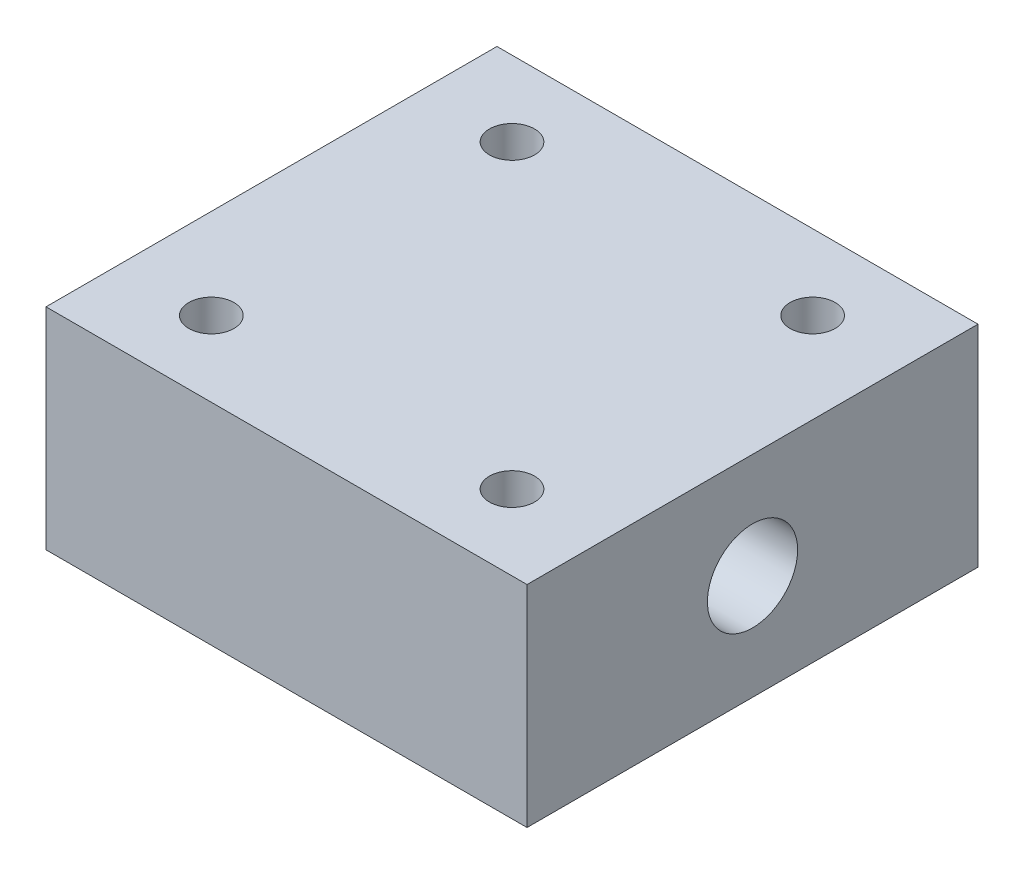
ISO-10303-21;
HEADER;
FILE_DESCRIPTION(('STEP AP214'),'2;1');
FILE_NAME('part.step','',(''),(''),'','','');
FILE_SCHEMA(('AUTOMOTIVE_DESIGN { 1 0 10303 214 1 1 1 1 }'));
ENDSEC;
DATA;
#1=APPLICATION_CONTEXT('core data for automotive mechanical design processes');
#2=APPLICATION_PROTOCOL_DEFINITION('international standard','automotive_design',2000,#1);
#3=PRODUCT_CONTEXT('',#1,'mechanical');
#4=PRODUCT('Part','Part','',(#3));
#5=PRODUCT_RELATED_PRODUCT_CATEGORY('part','',(#4));
#6=PRODUCT_DEFINITION_FORMATION('','',#4);
#7=PRODUCT_DEFINITION_CONTEXT('part definition',#1,'design');
#8=PRODUCT_DEFINITION('design','',#6,#7);
#9=PRODUCT_DEFINITION_SHAPE('','',#8);
#10=(LENGTH_UNIT() NAMED_UNIT(*) SI_UNIT(.MILLI.,.METRE.));
#11=(NAMED_UNIT(*) PLANE_ANGLE_UNIT() SI_UNIT($,.RADIAN.));
#12=(NAMED_UNIT(*) SI_UNIT($,.STERADIAN.) SOLID_ANGLE_UNIT());
#13=UNCERTAINTY_MEASURE_WITH_UNIT(LENGTH_MEASURE(1.E-05),#10,'distance_accuracy_value','');
#14=(GEOMETRIC_REPRESENTATION_CONTEXT(3) GLOBAL_UNCERTAINTY_ASSIGNED_CONTEXT((#13)) GLOBAL_UNIT_ASSIGNED_CONTEXT((#10,
#11,#12)) REPRESENTATION_CONTEXT('',''));
#15=CARTESIAN_POINT('',(0.,0.,0.));
#16=DIRECTION('',(0.,0.,1.));
#17=DIRECTION('',(1.,0.,0.));
#18=AXIS2_PLACEMENT_3D('',#15,#16,#17);
#19=CARTESIAN_POINT('',(16.,-7.,-30.));
#20=DIRECTION('',(1.,0.,0.));
#21=DIRECTION('',(0.,0.,-1.));
#22=AXIS2_PLACEMENT_3D('',#19,#20,#21);
#23=PLANE('',#22);
#24=CARTESIAN_POINT('',(16.,0.,-15.));
#25=DIRECTION('',(1.,0.,0.));
#26=DIRECTION('',(0.,0.,-1.));
#27=AXIS2_PLACEMENT_3D('',#24,#25,#26);
#28=CIRCLE('',#27,3.);
#29=CARTESIAN_POINT('',(16.,0.,-18.));
#30=VERTEX_POINT('',#29);
#31=EDGE_CURVE('E156',#30,#30,#28,.T.);
#32=ORIENTED_EDGE('',*,*,#31,.F.);
#33=EDGE_LOOP('',(#32));
#34=FACE_BOUND('',#33,.T.);
#35=DIRECTION('',(0.,1.,0.));
#36=VECTOR('',#35,1.);
#37=CARTESIAN_POINT('',(16.,-7.,0.));
#38=LINE('',#37,#36);
#39=CARTESIAN_POINT('',(16.,-7.,0.));
#40=VERTEX_POINT('',#39);
#41=CARTESIAN_POINT('',(16.,7.,0.));
#42=VERTEX_POINT('',#41);
#43=EDGE_CURVE('E104',#40,#42,#38,.T.);
#44=ORIENTED_EDGE('',*,*,#43,.F.);
#45=DIRECTION('',(0.,0.,1.));
#46=VECTOR('',#45,1.);
#47=CARTESIAN_POINT('',(16.,-7.,-30.));
#48=LINE('',#47,#46);
#49=CARTESIAN_POINT('',(16.,-7.,-30.));
#50=VERTEX_POINT('',#49);
#51=EDGE_CURVE('E11',#50,#40,#48,.T.);
#52=ORIENTED_EDGE('',*,*,#51,.F.);
#53=DIRECTION('',(0.,1.,0.));
#54=VECTOR('',#53,1.);
#55=CARTESIAN_POINT('',(16.,-7.,-30.));
#56=LINE('',#55,#54);
#57=CARTESIAN_POINT('',(16.,7.,-30.));
#58=VERTEX_POINT('',#57);
#59=EDGE_CURVE('E97',#50,#58,#56,.T.);
#60=ORIENTED_EDGE('',*,*,#59,.T.);
#61=DIRECTION('',(0.,0.,1.));
#62=VECTOR('',#61,1.);
#63=CARTESIAN_POINT('',(16.,7.,-30.));
#64=LINE('',#63,#62);
#65=EDGE_CURVE('E42',#58,#42,#64,.T.);
#66=ORIENTED_EDGE('',*,*,#65,.T.);
#67=EDGE_LOOP('',(#44,#52,#60,#66));
#68=FACE_BOUND('',#67,.T.);
#69=ADVANCED_FACE('F39',(#34,#68),#23,.T.);
#70=CARTESIAN_POINT('',(-16.,-7.,-30.));
#71=DIRECTION('',(0.,-1.,0.));
#72=DIRECTION('',(0.,0.,-1.));
#73=AXIS2_PLACEMENT_3D('',#70,#71,#72);
#74=PLANE('',#73);
#75=DIRECTION('',(1.,0.,0.));
#76=VECTOR('',#75,1.);
#77=CARTESIAN_POINT('',(-16.,-7.,0.));
#78=LINE('',#77,#76);
#79=CARTESIAN_POINT('',(-16.,-7.,0.));
#80=VERTEX_POINT('',#79);
#81=EDGE_CURVE('E99',#80,#40,#78,.T.);
#82=ORIENTED_EDGE('',*,*,#81,.F.);
#83=DIRECTION('',(0.,0.,1.));
#84=VECTOR('',#83,1.);
#85=CARTESIAN_POINT('',(-16.,-7.,-30.));
#86=LINE('',#85,#84);
#87=CARTESIAN_POINT('',(-16.,-7.,-30.));
#88=VERTEX_POINT('',#87);
#89=EDGE_CURVE('E48',#88,#80,#86,.T.);
#90=ORIENTED_EDGE('',*,*,#89,.F.);
#91=DIRECTION('',(1.,0.,0.));
#92=VECTOR('',#91,1.);
#93=CARTESIAN_POINT('',(-16.,-7.,-30.));
#94=LINE('',#93,#92);
#95=EDGE_CURVE('E94',#88,#50,#94,.T.);
#96=ORIENTED_EDGE('',*,*,#95,.T.);
#97=ORIENTED_EDGE('',*,*,#51,.T.);
#98=EDGE_LOOP('',(#82,#90,#96,#97));
#99=FACE_BOUND('',#98,.T.);
#100=ADVANCED_FACE('F115',(#99),#74,.T.);
#101=CARTESIAN_POINT('',(-16.,-7.,-30.));
#102=DIRECTION('',(-1.,0.,0.));
#103=DIRECTION('',(0.,0.,1.));
#104=AXIS2_PLACEMENT_3D('',#101,#102,#103);
#105=PLANE('',#104);
#106=CARTESIAN_POINT('',(-16.,0.,-15.));
#107=DIRECTION('',(-1.,0.,0.));
#108=DIRECTION('',(0.,0.,1.));
#109=AXIS2_PLACEMENT_3D('',#106,#107,#108);
#110=CIRCLE('',#109,3.);
#111=CARTESIAN_POINT('',(-16.,0.,-12.));
#112=VERTEX_POINT('',#111);
#113=EDGE_CURVE('E164',#112,#112,#110,.F.);
#114=ORIENTED_EDGE('',*,*,#113,.T.);
#115=EDGE_LOOP('',(#114));
#116=FACE_BOUND('',#115,.T.);
#117=DIRECTION('',(0.,-1.,0.));
#118=VECTOR('',#117,1.);
#119=CARTESIAN_POINT('',(-16.,-7.,0.));
#120=LINE('',#119,#118);
#121=CARTESIAN_POINT('',(-16.,7.,0.));
#122=VERTEX_POINT('',#121);
#123=EDGE_CURVE('E89',#122,#80,#120,.T.);
#124=ORIENTED_EDGE('',*,*,#123,.F.);
#125=DIRECTION('',(0.,0.,1.));
#126=VECTOR('',#125,1.);
#127=CARTESIAN_POINT('',(-16.,7.,-30.));
#128=LINE('',#127,#126);
#129=CARTESIAN_POINT('',(-16.,7.,-30.));
#130=VERTEX_POINT('',#129);
#131=EDGE_CURVE('E84',#130,#122,#128,.T.);
#132=ORIENTED_EDGE('',*,*,#131,.F.);
#133=DIRECTION('',(0.,-1.,0.));
#134=VECTOR('',#133,1.);
#135=CARTESIAN_POINT('',(-16.,-7.,-30.));
#136=LINE('',#135,#134);
#137=EDGE_CURVE('E87',#130,#88,#136,.T.);
#138=ORIENTED_EDGE('',*,*,#137,.T.);
#139=ORIENTED_EDGE('',*,*,#89,.T.);
#140=EDGE_LOOP('',(#124,#132,#138,#139));
#141=FACE_BOUND('',#140,.T.);
#142=ADVANCED_FACE('F86',(#116,#141),#105,.T.);
#143=CARTESIAN_POINT('',(-16.,7.,-30.));
#144=DIRECTION('',(0.,1.,0.));
#145=DIRECTION('',(0.,0.,1.));
#146=AXIS2_PLACEMENT_3D('',#143,#144,#145);
#147=PLANE('',#146);
#148=CARTESIAN_POINT('',(-10.,7.,-5.));
#149=DIRECTION('',(0.,1.,0.));
#150=DIRECTION('',(0.,0.,-1.));
#151=AXIS2_PLACEMENT_3D('',#148,#149,#150);
#152=CIRCLE('',#151,1.5);
#153=CARTESIAN_POINT('',(-10.,7.,-6.5));
#154=VERTEX_POINT('',#153);
#155=EDGE_CURVE('E135',#154,#154,#152,.T.);
#156=ORIENTED_EDGE('',*,*,#155,.F.);
#157=EDGE_LOOP('',(#156));
#158=FACE_BOUND('',#157,.T.);
#159=CARTESIAN_POINT('',(10.,7.,-5.));
#160=DIRECTION('',(0.,1.,0.));
#161=DIRECTION('',(0.,0.,1.));
#162=AXIS2_PLACEMENT_3D('',#159,#160,#161);
#163=CIRCLE('',#162,1.5);
#164=CARTESIAN_POINT('',(10.,7.,-3.5));
#165=VERTEX_POINT('',#164);
#166=EDGE_CURVE('E139',#165,#165,#163,.T.);
#167=ORIENTED_EDGE('',*,*,#166,.F.);
#168=EDGE_LOOP('',(#167));
#169=FACE_BOUND('',#168,.T.);
#170=CARTESIAN_POINT('',(10.,7.,-25.));
#171=DIRECTION('',(0.,1.,0.));
#172=DIRECTION('',(0.,0.,-1.));
#173=AXIS2_PLACEMENT_3D('',#170,#171,#172);
#174=CIRCLE('',#173,1.5);
#175=CARTESIAN_POINT('',(10.,7.,-26.5));
#176=VERTEX_POINT('',#175);
#177=EDGE_CURVE('E143',#176,#176,#174,.T.);
#178=ORIENTED_EDGE('',*,*,#177,.F.);
#179=EDGE_LOOP('',(#178));
#180=FACE_BOUND('',#179,.T.);
#181=CARTESIAN_POINT('',(-10.,7.,-25.));
#182=DIRECTION('',(0.,1.,0.));
#183=DIRECTION('',(0.,0.,1.));
#184=AXIS2_PLACEMENT_3D('',#181,#182,#183);
#185=CIRCLE('',#184,1.5);
#186=CARTESIAN_POINT('',(-10.,7.,-23.5));
#187=VERTEX_POINT('',#186);
#188=EDGE_CURVE('E146',#187,#187,#185,.T.);
#189=ORIENTED_EDGE('',*,*,#188,.F.);
#190=EDGE_LOOP('',(#189));
#191=FACE_BOUND('',#190,.T.);
#192=DIRECTION('',(-1.,0.,0.));
#193=VECTOR('',#192,1.);
#194=CARTESIAN_POINT('',(-16.,7.,0.));
#195=LINE('',#194,#193);
#196=EDGE_CURVE('E107',#42,#122,#195,.T.);
#197=ORIENTED_EDGE('',*,*,#196,.F.);
#198=ORIENTED_EDGE('',*,*,#65,.F.);
#199=DIRECTION('',(-1.,0.,0.));
#200=VECTOR('',#199,1.);
#201=CARTESIAN_POINT('',(-16.,7.,-30.));
#202=LINE('',#201,#200);
#203=EDGE_CURVE('E93',#58,#130,#202,.T.);
#204=ORIENTED_EDGE('',*,*,#203,.T.);
#205=ORIENTED_EDGE('',*,*,#131,.T.);
#206=EDGE_LOOP('',(#197,#198,#204,#205));
#207=FACE_BOUND('',#206,.T.);
#208=ADVANCED_FACE('F96',(#158,#169,#180,#191,#207),#147,.T.);
#209=CARTESIAN_POINT('',(0.,0.,-30.));
#210=DIRECTION('',(0.,0.,-1.));
#211=DIRECTION('',(-1.,0.,0.));
#212=AXIS2_PLACEMENT_3D('',#209,#210,#211);
#213=PLANE('',#212);
#214=ORIENTED_EDGE('',*,*,#59,.F.);
#215=ORIENTED_EDGE('',*,*,#95,.F.);
#216=ORIENTED_EDGE('',*,*,#137,.F.);
#217=ORIENTED_EDGE('',*,*,#203,.F.);
#218=EDGE_LOOP('',(#214,#215,#216,#217));
#219=FACE_BOUND('',#218,.T.);
#220=ADVANCED_FACE('F92',(#219),#213,.T.);
#221=CARTESIAN_POINT('',(0.,0.,0.));
#222=DIRECTION('',(0.,0.,-1.));
#223=DIRECTION('',(-1.,0.,0.));
#224=AXIS2_PLACEMENT_3D('',#221,#222,#223);
#225=PLANE('',#224);
#226=ORIENTED_EDGE('',*,*,#43,.T.);
#227=ORIENTED_EDGE('',*,*,#196,.T.);
#228=ORIENTED_EDGE('',*,*,#123,.T.);
#229=ORIENTED_EDGE('',*,*,#81,.T.);
#230=EDGE_LOOP('',(#226,#227,#228,#229));
#231=FACE_BOUND('',#230,.T.);
#232=ADVANCED_FACE('F114',(#231),#225,.F.);
#233=CARTESIAN_POINT('',(-10.,-3.,-25.));
#234=DIRECTION('',(0.,1.,0.));
#235=DIRECTION('',(0.,0.,1.));
#236=AXIS2_PLACEMENT_3D('',#233,#234,#235);
#237=CYLINDRICAL_SURFACE('',#236,1.5);
#238=CARTESIAN_POINT('',(-10.,-3.,-25.));
#239=DIRECTION('',(0.,1.,0.));
#240=DIRECTION('',(0.,0.,1.));
#241=AXIS2_PLACEMENT_3D('',#238,#239,#240);
#242=CIRCLE('',#241,1.5);
#243=CARTESIAN_POINT('',(-10.,-3.,-23.5));
#244=VERTEX_POINT('',#243);
#245=EDGE_CURVE('E108',#244,#244,#242,.T.);
#246=ORIENTED_EDGE('',*,*,#245,.F.);
#247=EDGE_LOOP('',(#246));
#248=FACE_BOUND('',#247,.T.);
#249=ORIENTED_EDGE('',*,*,#188,.T.);
#250=EDGE_LOOP('',(#249));
#251=FACE_BOUND('',#250,.T.);
#252=ADVANCED_FACE('F205',(#248,#251),#237,.F.);
#253=CARTESIAN_POINT('',(-10.,-3.,-25.));
#254=DIRECTION('',(0.,1.,0.));
#255=DIRECTION('',(0.,0.,1.));
#256=AXIS2_PLACEMENT_3D('',#253,#254,#255);
#257=PLANE('',#256);
#258=ORIENTED_EDGE('',*,*,#245,.T.);
#259=EDGE_LOOP('',(#258));
#260=FACE_BOUND('',#259,.T.);
#261=ADVANCED_FACE('F191',(#260),#257,.T.);
#262=CARTESIAN_POINT('',(10.,-3.,-25.));
#263=DIRECTION('',(0.,1.,0.));
#264=DIRECTION('',(0.,0.,1.));
#265=AXIS2_PLACEMENT_3D('',#262,#263,#264);
#266=CYLINDRICAL_SURFACE('',#265,1.5);
#267=CARTESIAN_POINT('',(10.,-3.,-25.));
#268=DIRECTION('',(0.,1.,0.));
#269=DIRECTION('',(0.,0.,-1.));
#270=AXIS2_PLACEMENT_3D('',#267,#268,#269);
#271=CIRCLE('',#270,1.5);
#272=CARTESIAN_POINT('',(10.,-3.,-26.5));
#273=VERTEX_POINT('',#272);
#274=EDGE_CURVE('E148',#273,#273,#271,.T.);
#275=ORIENTED_EDGE('',*,*,#274,.F.);
#276=EDGE_LOOP('',(#275));
#277=FACE_BOUND('',#276,.T.);
#278=ORIENTED_EDGE('',*,*,#177,.T.);
#279=EDGE_LOOP('',(#278));
#280=FACE_BOUND('',#279,.T.);
#281=ADVANCED_FACE('F187',(#277,#280),#266,.F.);
#282=CARTESIAN_POINT('',(10.,-3.,-25.));
#283=DIRECTION('',(0.,-1.,0.));
#284=DIRECTION('',(0.,0.,-1.));
#285=AXIS2_PLACEMENT_3D('',#282,#283,#284);
#286=PLANE('',#285);
#287=ORIENTED_EDGE('',*,*,#274,.T.);
#288=EDGE_LOOP('',(#287));
#289=FACE_BOUND('',#288,.T.);
#290=ADVANCED_FACE('F183',(#289),#286,.F.);
#291=CARTESIAN_POINT('',(10.,-3.,-5.));
#292=DIRECTION('',(0.,1.,0.));
#293=DIRECTION('',(0.,0.,1.));
#294=AXIS2_PLACEMENT_3D('',#291,#292,#293);
#295=CYLINDRICAL_SURFACE('',#294,1.5);
#296=CARTESIAN_POINT('',(10.,-3.,-5.));
#297=DIRECTION('',(0.,1.,0.));
#298=DIRECTION('',(0.,0.,1.));
#299=AXIS2_PLACEMENT_3D('',#296,#297,#298);
#300=CIRCLE('',#299,1.5);
#301=CARTESIAN_POINT('',(10.,-3.,-3.5));
#302=VERTEX_POINT('',#301);
#303=EDGE_CURVE('E160',#302,#302,#300,.T.);
#304=ORIENTED_EDGE('',*,*,#303,.F.);
#305=EDGE_LOOP('',(#304));
#306=FACE_BOUND('',#305,.T.);
#307=ORIENTED_EDGE('',*,*,#166,.T.);
#308=EDGE_LOOP('',(#307));
#309=FACE_BOUND('',#308,.T.);
#310=ADVANCED_FACE('F186',(#306,#309),#295,.F.);
#311=CARTESIAN_POINT('',(10.,-3.,-5.));
#312=DIRECTION('',(0.,1.,0.));
#313=DIRECTION('',(0.,0.,1.));
#314=AXIS2_PLACEMENT_3D('',#311,#312,#313);
#315=PLANE('',#314);
#316=ORIENTED_EDGE('',*,*,#303,.T.);
#317=EDGE_LOOP('',(#316));
#318=FACE_BOUND('',#317,.T.);
#319=ADVANCED_FACE('F193',(#318),#315,.T.);
#320=CARTESIAN_POINT('',(-10.,-3.,-5.));
#321=DIRECTION('',(0.,1.,0.));
#322=DIRECTION('',(0.,0.,1.));
#323=AXIS2_PLACEMENT_3D('',#320,#321,#322);
#324=CYLINDRICAL_SURFACE('',#323,1.5);
#325=CARTESIAN_POINT('',(-10.,-3.,-5.));
#326=DIRECTION('',(0.,1.,0.));
#327=DIRECTION('',(0.,0.,-1.));
#328=AXIS2_PLACEMENT_3D('',#325,#326,#327);
#329=CIRCLE('',#328,1.5);
#330=CARTESIAN_POINT('',(-10.,-3.,-6.5));
#331=VERTEX_POINT('',#330);
#332=EDGE_CURVE('E155',#331,#331,#329,.T.);
#333=ORIENTED_EDGE('',*,*,#332,.F.);
#334=EDGE_LOOP('',(#333));
#335=FACE_BOUND('',#334,.T.);
#336=ORIENTED_EDGE('',*,*,#155,.T.);
#337=EDGE_LOOP('',(#336));
#338=FACE_BOUND('',#337,.T.);
#339=ADVANCED_FACE('F178',(#335,#338),#324,.F.);
#340=CARTESIAN_POINT('',(-10.,-3.,-5.));
#341=DIRECTION('',(0.,-1.,0.));
#342=DIRECTION('',(0.,0.,-1.));
#343=AXIS2_PLACEMENT_3D('',#340,#341,#342);
#344=PLANE('',#343);
#345=ORIENTED_EDGE('',*,*,#332,.T.);
#346=EDGE_LOOP('',(#345));
#347=FACE_BOUND('',#346,.T.);
#348=ADVANCED_FACE('F172',(#347),#344,.F.);
#349=CARTESIAN_POINT('',(-16.001,0.,-15.));
#350=DIRECTION('',(1.,0.,0.));
#351=DIRECTION('',(0.,0.,-1.));
#352=AXIS2_PLACEMENT_3D('',#349,#350,#351);
#353=CYLINDRICAL_SURFACE('',#352,3.);
#354=ORIENTED_EDGE('',*,*,#113,.F.);
#355=EDGE_LOOP('',(#354));
#356=FACE_BOUND('',#355,.T.);
#357=ORIENTED_EDGE('',*,*,#31,.T.);
#358=EDGE_LOOP('',(#357));
#359=FACE_BOUND('',#358,.T.);
#360=ADVANCED_FACE('F170',(#356,#359),#353,.F.);
#361=CLOSED_SHELL('',(#69,#100,#142,#208,#220,#232,#252,#261,#281,#290,#310,#319,#339,#348,#360));
#362=MANIFOLD_SOLID_BREP('B2',#361);
#363=ADVANCED_BREP_SHAPE_REPRESENTATION('',(#18,#362),#14);
#364=SHAPE_DEFINITION_REPRESENTATION(#9,#363);
ENDSEC;
END-ISO-10303-21;
